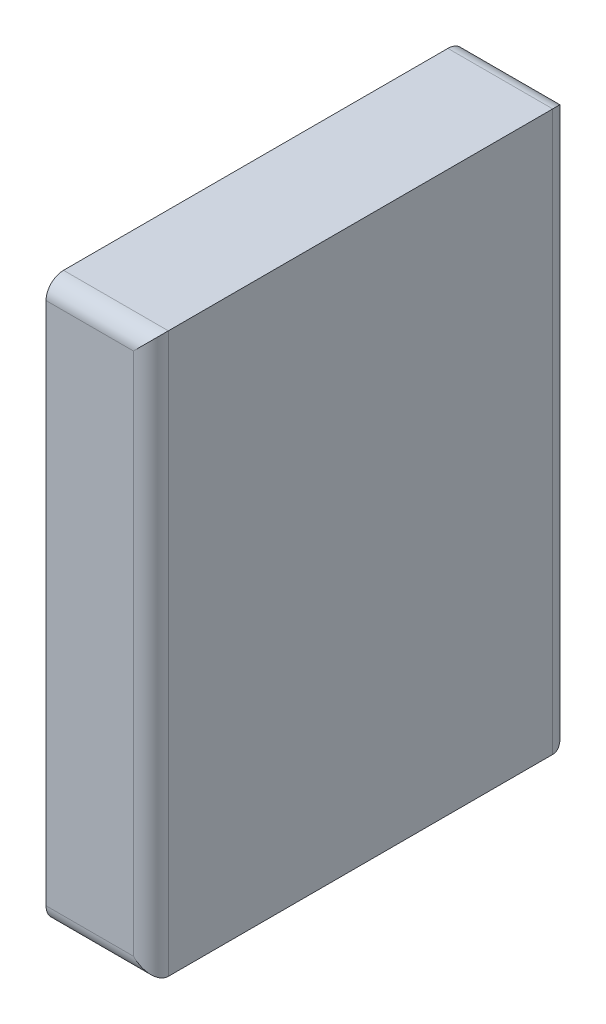
ISO-10303-21;
HEADER;
FILE_DESCRIPTION(('STEP AP214'),'2;1');
FILE_NAME('part.step','',(''),(''),'','','');
FILE_SCHEMA(('AUTOMOTIVE_DESIGN { 1 0 10303 214 1 1 1 1 }'));
ENDSEC;
DATA;
#1=APPLICATION_CONTEXT('core data for automotive mechanical design processes');
#2=APPLICATION_PROTOCOL_DEFINITION('international standard','automotive_design',2000,#1);
#3=PRODUCT_CONTEXT('',#1,'mechanical');
#4=PRODUCT('Part','Part','',(#3));
#5=PRODUCT_RELATED_PRODUCT_CATEGORY('part','',(#4));
#6=PRODUCT_DEFINITION_FORMATION('','',#4);
#7=PRODUCT_DEFINITION_CONTEXT('part definition',#1,'design');
#8=PRODUCT_DEFINITION('design','',#6,#7);
#9=PRODUCT_DEFINITION_SHAPE('','',#8);
#10=(LENGTH_UNIT() NAMED_UNIT(*) SI_UNIT(.MILLI.,.METRE.));
#11=(NAMED_UNIT(*) PLANE_ANGLE_UNIT() SI_UNIT($,.RADIAN.));
#12=(NAMED_UNIT(*) SI_UNIT($,.STERADIAN.) SOLID_ANGLE_UNIT());
#13=UNCERTAINTY_MEASURE_WITH_UNIT(LENGTH_MEASURE(1.E-05),#10,'distance_accuracy_value','');
#14=(GEOMETRIC_REPRESENTATION_CONTEXT(3) GLOBAL_UNCERTAINTY_ASSIGNED_CONTEXT((#13)) GLOBAL_UNIT_ASSIGNED_CONTEXT((#10,
#11,#12)) REPRESENTATION_CONTEXT('',''));
#15=CARTESIAN_POINT('',(0.,0.,0.));
#16=DIRECTION('',(0.,0.,1.));
#17=DIRECTION('',(1.,0.,0.));
#18=AXIS2_PLACEMENT_3D('',#15,#16,#17);
#19=CARTESIAN_POINT('',(0.8,-0.8,0.6));
#20=DIRECTION('',(0.,-1.,0.));
#21=DIRECTION('',(0.,0.,-1.));
#22=AXIS2_PLACEMENT_3D('',#19,#20,#21);
#23=PLANE('',#22);
#24=DIRECTION('',(0.,0.,1.));
#25=VECTOR('',#24,1.);
#26=CARTESIAN_POINT('',(1.3,-0.8,0.824600008));
#27=LINE('',#26,#25);
#28=CARTESIAN_POINT('',(1.3,-0.8,0.05));
#29=VERTEX_POINT('',#28);
#30=CARTESIAN_POINT('',(1.3,-0.8,1.15));
#31=VERTEX_POINT('',#30);
#32=EDGE_CURVE('E41',#29,#31,#27,.T.);
#33=ORIENTED_EDGE('',*,*,#32,.F.);
#34=DIRECTION('',(1.,0.,0.));
#35=VECTOR('',#34,1.);
#36=CARTESIAN_POINT('',(1.6,-0.8,0.05));
#37=LINE('',#36,#35);
#38=CARTESIAN_POINT('',(1.6000000050769,-0.800000005076897,0.05));
#39=VERTEX_POINT('',#38);
#40=EDGE_CURVE('E11',#29,#39,#37,.T.);
#41=ORIENTED_EDGE('',*,*,#40,.T.);
#42=DIRECTION('',(0.,0.,-1.));
#43=VECTOR('',#42,1.);
#44=CARTESIAN_POINT('',(1.6,-0.8,0.6));
#45=LINE('',#44,#43);
#46=CARTESIAN_POINT('',(1.6000000050769,-0.800000005076897,1.15));
#47=VERTEX_POINT('',#46);
#48=EDGE_CURVE('E185',#47,#39,#45,.T.);
#49=ORIENTED_EDGE('',*,*,#48,.F.);
#50=DIRECTION('',(-1.,0.,0.));
#51=VECTOR('',#50,1.);
#52=CARTESIAN_POINT('',(1.3,-0.8,1.15));
#53=LINE('',#52,#51);
#54=EDGE_CURVE('E28',#47,#31,#53,.T.);
#55=ORIENTED_EDGE('',*,*,#54,.T.);
#56=EDGE_LOOP('',(#33,#41,#49,#55));
#57=FACE_BOUND('',#56,.T.);
#58=ADVANCED_FACE('F17',(#57),#23,.T.);
#59=CARTESIAN_POINT('',(0.8,0.8,0.6));
#60=DIRECTION('',(0.,-1.,0.));
#61=DIRECTION('',(0.,0.,-1.));
#62=AXIS2_PLACEMENT_3D('',#59,#60,#61);
#63=PLANE('',#62);
#64=DIRECTION('',(0.,0.,-1.));
#65=VECTOR('',#64,1.);
#66=CARTESIAN_POINT('',(1.6,0.8,0.6));
#67=LINE('',#66,#65);
#68=CARTESIAN_POINT('',(1.6000000050769,0.800000005076897,1.15));
#69=VERTEX_POINT('',#68);
#70=CARTESIAN_POINT('',(1.6000000050769,0.800000005076897,0.05));
#71=VERTEX_POINT('',#70);
#72=EDGE_CURVE('E162',#69,#71,#67,.T.);
#73=ORIENTED_EDGE('',*,*,#72,.T.);
#74=DIRECTION('',(-1.,0.,0.));
#75=VECTOR('',#74,1.);
#76=CARTESIAN_POINT('',(0.8,0.8,0.05));
#77=LINE('',#76,#75);
#78=CARTESIAN_POINT('',(1.3,0.8,0.05));
#79=VERTEX_POINT('',#78);
#80=EDGE_CURVE('E165',#71,#79,#77,.T.);
#81=ORIENTED_EDGE('',*,*,#80,.T.);
#82=DIRECTION('',(0.,0.,1.));
#83=VECTOR('',#82,1.);
#84=CARTESIAN_POINT('',(1.3,0.8,0.824600008));
#85=LINE('',#84,#83);
#86=CARTESIAN_POINT('',(1.3,0.8,1.15));
#87=VERTEX_POINT('',#86);
#88=EDGE_CURVE('E119',#79,#87,#85,.T.);
#89=ORIENTED_EDGE('',*,*,#88,.T.);
#90=DIRECTION('',(1.,0.,0.));
#91=VECTOR('',#90,1.);
#92=CARTESIAN_POINT('',(0.8,0.8,1.15));
#93=LINE('',#92,#91);
#94=EDGE_CURVE('E157',#87,#69,#93,.T.);
#95=ORIENTED_EDGE('',*,*,#94,.T.);
#96=EDGE_LOOP('',(#73,#81,#89,#95));
#97=FACE_BOUND('',#96,.T.);
#98=ADVANCED_FACE('F256',(#97),#63,.F.);
#99=CARTESIAN_POINT('',(1.45,-0.8,0.));
#100=DIRECTION('',(0.,0.,1.));
#101=DIRECTION('',(1.,0.,0.));
#102=AXIS2_PLACEMENT_3D('',#99,#100,#101);
#103=PLANE('',#102);
#104=DIRECTION('',(0.,-1.,0.));
#105=VECTOR('',#104,1.);
#106=CARTESIAN_POINT('',(1.55,-0.8,0.));
#107=LINE('',#106,#105);
#108=CARTESIAN_POINT('',(1.55,0.75,0.));
#109=VERTEX_POINT('',#108);
#110=CARTESIAN_POINT('',(1.55,-0.75,0.));
#111=VERTEX_POINT('',#110);
#112=EDGE_CURVE('E149',#109,#111,#107,.T.);
#113=ORIENTED_EDGE('',*,*,#112,.T.);
#114=DIRECTION('',(-1.,0.,0.));
#115=VECTOR('',#114,1.);
#116=CARTESIAN_POINT('',(1.3,-0.75,0.));
#117=LINE('',#116,#115);
#118=CARTESIAN_POINT('',(1.3,-0.75,0.));
#119=VERTEX_POINT('',#118);
#120=EDGE_CURVE('E110',#111,#119,#117,.T.);
#121=ORIENTED_EDGE('',*,*,#120,.T.);
#122=DIRECTION('',(0.,1.,0.));
#123=VECTOR('',#122,1.);
#124=CARTESIAN_POINT('',(1.3,-0.8,0.));
#125=LINE('',#124,#123);
#126=CARTESIAN_POINT('',(1.3,0.75,0.));
#127=VERTEX_POINT('',#126);
#128=EDGE_CURVE('E106',#119,#127,#125,.T.);
#129=ORIENTED_EDGE('',*,*,#128,.T.);
#130=DIRECTION('',(1.,0.,0.));
#131=VECTOR('',#130,1.);
#132=CARTESIAN_POINT('',(1.45,0.75,0.));
#133=LINE('',#132,#131);
#134=EDGE_CURVE('E95',#127,#109,#133,.T.);
#135=ORIENTED_EDGE('',*,*,#134,.T.);
#136=EDGE_LOOP('',(#113,#121,#129,#135));
#137=FACE_BOUND('',#136,.T.);
#138=ADVANCED_FACE('F109',(#137),#103,.F.);
#139=CARTESIAN_POINT('',(1.3,-0.8,0.824600008));
#140=DIRECTION('',(1.,0.,0.));
#141=DIRECTION('',(0.,1.,0.));
#142=AXIS2_PLACEMENT_3D('',#139,#140,#141);
#143=PLANE('',#142);
#144=ORIENTED_EDGE('',*,*,#128,.F.);
#145=CARTESIAN_POINT('',(1.3,-0.75,0.05));
#146=DIRECTION('',(-1.,0.,0.));
#147=DIRECTION('',(0.,0.,-1.));
#148=AXIS2_PLACEMENT_3D('',#145,#146,#147);
#149=CIRCLE('',#148,0.05);
#150=EDGE_CURVE('E107',#119,#29,#149,.T.);
#151=ORIENTED_EDGE('',*,*,#150,.T.);
#152=ORIENTED_EDGE('',*,*,#32,.T.);
#153=CARTESIAN_POINT('',(1.3,-0.75,1.15));
#154=DIRECTION('',(-1.,0.,0.));
#155=DIRECTION('',(0.,0.,-1.));
#156=AXIS2_PLACEMENT_3D('',#153,#154,#155);
#157=CIRCLE('',#156,0.05);
#158=CARTESIAN_POINT('',(1.3,-0.75,1.2));
#159=VERTEX_POINT('',#158);
#160=EDGE_CURVE('E161',#31,#159,#157,.T.);
#161=ORIENTED_EDGE('',*,*,#160,.T.);
#162=DIRECTION('',(0.,1.,0.));
#163=VECTOR('',#162,1.);
#164=CARTESIAN_POINT('',(1.3,-0.8,1.2));
#165=LINE('',#164,#163);
#166=CARTESIAN_POINT('',(1.3,0.75,1.2));
#167=VERTEX_POINT('',#166);
#168=EDGE_CURVE('E129',#159,#167,#165,.T.);
#169=ORIENTED_EDGE('',*,*,#168,.T.);
#170=CARTESIAN_POINT('',(1.3,0.75,1.15));
#171=DIRECTION('',(-1.,0.,0.));
#172=DIRECTION('',(0.,0.,-1.));
#173=AXIS2_PLACEMENT_3D('',#170,#171,#172);
#174=CIRCLE('',#173,0.05);
#175=EDGE_CURVE('E122',#167,#87,#174,.T.);
#176=ORIENTED_EDGE('',*,*,#175,.T.);
#177=ORIENTED_EDGE('',*,*,#88,.F.);
#178=CARTESIAN_POINT('',(1.3,0.75,0.05));
#179=DIRECTION('',(-1.,0.,0.));
#180=DIRECTION('',(0.,0.,-1.));
#181=AXIS2_PLACEMENT_3D('',#178,#179,#180);
#182=CIRCLE('',#181,0.05);
#183=EDGE_CURVE('E21',#79,#127,#182,.T.);
#184=ORIENTED_EDGE('',*,*,#183,.T.);
#185=EDGE_LOOP('',(#144,#151,#152,#161,#169,#176,#177,#184));
#186=FACE_BOUND('',#185,.T.);
#187=ADVANCED_FACE('F116',(#186),#143,.F.);
#188=CARTESIAN_POINT('',(1.45,-0.8,1.2));
#189=DIRECTION('',(0.,0.,-1.));
#190=DIRECTION('',(-1.,0.,0.));
#191=AXIS2_PLACEMENT_3D('',#188,#189,#190);
#192=PLANE('',#191);
#193=ORIENTED_EDGE('',*,*,#168,.F.);
#194=DIRECTION('',(1.,0.,0.));
#195=VECTOR('',#194,1.);
#196=CARTESIAN_POINT('',(1.6,-0.75,1.2));
#197=LINE('',#196,#195);
#198=CARTESIAN_POINT('',(1.55,-0.75,1.2));
#199=VERTEX_POINT('',#198);
#200=EDGE_CURVE('E123',#159,#199,#197,.T.);
#201=ORIENTED_EDGE('',*,*,#200,.T.);
#202=DIRECTION('',(0.,1.,0.));
#203=VECTOR('',#202,1.);
#204=CARTESIAN_POINT('',(1.55,-0.8,1.2));
#205=LINE('',#204,#203);
#206=CARTESIAN_POINT('',(1.55,0.75,1.2));
#207=VERTEX_POINT('',#206);
#208=EDGE_CURVE('E132',#199,#207,#205,.T.);
#209=ORIENTED_EDGE('',*,*,#208,.T.);
#210=DIRECTION('',(-1.,0.,0.));
#211=VECTOR('',#210,1.);
#212=CARTESIAN_POINT('',(1.45,0.75,1.2));
#213=LINE('',#212,#211);
#214=EDGE_CURVE('E141',#207,#167,#213,.T.);
#215=ORIENTED_EDGE('',*,*,#214,.T.);
#216=EDGE_LOOP('',(#193,#201,#209,#215));
#217=FACE_BOUND('',#216,.T.);
#218=ADVANCED_FACE('F209',(#217),#192,.F.);
#219=CARTESIAN_POINT('',(1.55,-0.8,1.15));
#220=DIRECTION('',(0.,-1.,0.));
#221=DIRECTION('',(0.,0.,1.));
#222=AXIS2_PLACEMENT_3D('',#219,#220,#221);
#223=CYLINDRICAL_SURFACE('',#222,0.05);
#224=CARTESIAN_POINT('',(1.55,-0.75,1.15));
#225=DIRECTION('',(0.707106781186548,0.707106781186548,0.));
#226=DIRECTION('',(-0.707106781186548,0.707106781186548,0.));
#227=AXIS2_PLACEMENT_3D('',#224,#225,#226);
#228=ELLIPSE('',#227,0.0707107,0.05);
#229=EDGE_CURVE('E155',#199,#47,#228,.T.);
#230=ORIENTED_EDGE('',*,*,#229,.T.);
#231=DIRECTION('',(0.,-1.,0.));
#232=VECTOR('',#231,1.);
#233=CARTESIAN_POINT('',(1.6,-0.8,1.15));
#234=LINE('',#233,#232);
#235=EDGE_CURVE('E144',#69,#47,#234,.T.);
#236=ORIENTED_EDGE('',*,*,#235,.F.);
#237=CARTESIAN_POINT('',(1.55,0.75,1.15));
#238=DIRECTION('',(0.707106781186548,-0.707106781186548,0.));
#239=DIRECTION('',(0.707106781186548,0.707106781186548,0.));
#240=AXIS2_PLACEMENT_3D('',#237,#238,#239);
#241=ELLIPSE('',#240,0.0707107,0.05);
#242=EDGE_CURVE('E167',#69,#207,#241,.T.);
#243=ORIENTED_EDGE('',*,*,#242,.T.);
#244=ORIENTED_EDGE('',*,*,#208,.F.);
#245=EDGE_LOOP('',(#230,#236,#243,#244));
#246=FACE_BOUND('',#245,.T.);
#247=ADVANCED_FACE('F271',(#246),#223,.T.);
#248=CARTESIAN_POINT('',(0.8,0.75,1.15));
#249=DIRECTION('',(-1.,0.,0.));
#250=DIRECTION('',(0.,0.,-1.));
#251=AXIS2_PLACEMENT_3D('',#248,#249,#250);
#252=CYLINDRICAL_SURFACE('',#251,0.05);
#253=ORIENTED_EDGE('',*,*,#175,.F.);
#254=ORIENTED_EDGE('',*,*,#214,.F.);
#255=ORIENTED_EDGE('',*,*,#242,.F.);
#256=ORIENTED_EDGE('',*,*,#94,.F.);
#257=EDGE_LOOP('',(#253,#254,#255,#256));
#258=FACE_BOUND('',#257,.T.);
#259=ADVANCED_FACE('F212',(#258),#252,.T.);
#260=CARTESIAN_POINT('',(1.45,-0.75,1.15));
#261=DIRECTION('',(1.,0.,0.));
#262=DIRECTION('',(0.,0.,1.));
#263=AXIS2_PLACEMENT_3D('',#260,#261,#262);
#264=CYLINDRICAL_SURFACE('',#263,0.05);
#265=ORIENTED_EDGE('',*,*,#160,.F.);
#266=ORIENTED_EDGE('',*,*,#54,.F.);
#267=ORIENTED_EDGE('',*,*,#229,.F.);
#268=ORIENTED_EDGE('',*,*,#200,.F.);
#269=EDGE_LOOP('',(#265,#266,#267,#268));
#270=FACE_BOUND('',#269,.T.);
#271=ADVANCED_FACE('F19',(#270),#264,.T.);
#272=CARTESIAN_POINT('',(1.55,-0.8,0.05));
#273=DIRECTION('',(0.,-1.,0.));
#274=DIRECTION('',(0.,0.,1.));
#275=AXIS2_PLACEMENT_3D('',#272,#273,#274);
#276=CYLINDRICAL_SURFACE('',#275,0.05);
#277=CARTESIAN_POINT('',(1.55,-0.75,0.05));
#278=DIRECTION('',(0.707106781186548,0.707106781186548,0.));
#279=DIRECTION('',(0.707106781186548,-0.707106781186548,0.));
#280=AXIS2_PLACEMENT_3D('',#277,#278,#279);
#281=ELLIPSE('',#280,0.0707107,0.05);
#282=EDGE_CURVE('E171',#39,#111,#281,.T.);
#283=ORIENTED_EDGE('',*,*,#282,.T.);
#284=ORIENTED_EDGE('',*,*,#112,.F.);
#285=CARTESIAN_POINT('',(1.55,0.75,0.05));
#286=DIRECTION('',(0.707106781186548,-0.707106781186548,0.));
#287=DIRECTION('',(-0.707106781186548,-0.707106781186548,0.));
#288=AXIS2_PLACEMENT_3D('',#285,#286,#287);
#289=ELLIPSE('',#288,0.0707107,0.05);
#290=EDGE_CURVE('E101',#109,#71,#289,.T.);
#291=ORIENTED_EDGE('',*,*,#290,.T.);
#292=DIRECTION('',(0.,1.,0.));
#293=VECTOR('',#292,1.);
#294=CARTESIAN_POINT('',(1.6,-0.8,0.05));
#295=LINE('',#294,#293);
#296=EDGE_CURVE('E188',#39,#71,#295,.T.);
#297=ORIENTED_EDGE('',*,*,#296,.F.);
#298=EDGE_LOOP('',(#283,#284,#291,#297));
#299=FACE_BOUND('',#298,.T.);
#300=ADVANCED_FACE('F264',(#299),#276,.T.);
#301=CARTESIAN_POINT('',(0.8,0.75,0.05));
#302=DIRECTION('',(1.,0.,0.));
#303=DIRECTION('',(0.,0.,1.));
#304=AXIS2_PLACEMENT_3D('',#301,#302,#303);
#305=CYLINDRICAL_SURFACE('',#304,0.05);
#306=ORIENTED_EDGE('',*,*,#183,.F.);
#307=ORIENTED_EDGE('',*,*,#80,.F.);
#308=ORIENTED_EDGE('',*,*,#290,.F.);
#309=ORIENTED_EDGE('',*,*,#134,.F.);
#310=EDGE_LOOP('',(#306,#307,#308,#309));
#311=FACE_BOUND('',#310,.T.);
#312=ADVANCED_FACE('F97',(#311),#305,.T.);
#313=CARTESIAN_POINT('',(1.45,-0.75,0.05));
#314=DIRECTION('',(-1.,0.,0.));
#315=DIRECTION('',(0.,0.,-1.));
#316=AXIS2_PLACEMENT_3D('',#313,#314,#315);
#317=CYLINDRICAL_SURFACE('',#316,0.05);
#318=ORIENTED_EDGE('',*,*,#150,.F.);
#319=ORIENTED_EDGE('',*,*,#120,.F.);
#320=ORIENTED_EDGE('',*,*,#282,.F.);
#321=ORIENTED_EDGE('',*,*,#40,.F.);
#322=EDGE_LOOP('',(#318,#319,#320,#321));
#323=FACE_BOUND('',#322,.T.);
#324=ADVANCED_FACE('F266',(#323),#317,.T.);
#325=CARTESIAN_POINT('',(1.6,-0.8,0.6));
#326=DIRECTION('',(-1.,0.,0.));
#327=DIRECTION('',(0.,0.,1.));
#328=AXIS2_PLACEMENT_3D('',#325,#326,#327);
#329=PLANE('',#328);
#330=ORIENTED_EDGE('',*,*,#72,.F.);
#331=ORIENTED_EDGE('',*,*,#235,.T.);
#332=ORIENTED_EDGE('',*,*,#48,.T.);
#333=ORIENTED_EDGE('',*,*,#296,.T.);
#334=EDGE_LOOP('',(#330,#331,#332,#333));
#335=FACE_BOUND('',#334,.T.);
#336=ADVANCED_FACE('F259',(#335),#329,.F.);
#337=CLOSED_SHELL('',(#58,#98,#138,#187,#218,#247,#259,#271,#300,#312,#324,#336));
#338=MANIFOLD_SOLID_BREP('B1',#337);
#339=ADVANCED_BREP_SHAPE_REPRESENTATION('',(#18,#338),#14);
#340=SHAPE_DEFINITION_REPRESENTATION(#9,#339);
ENDSEC;
END-ISO-10303-21;
